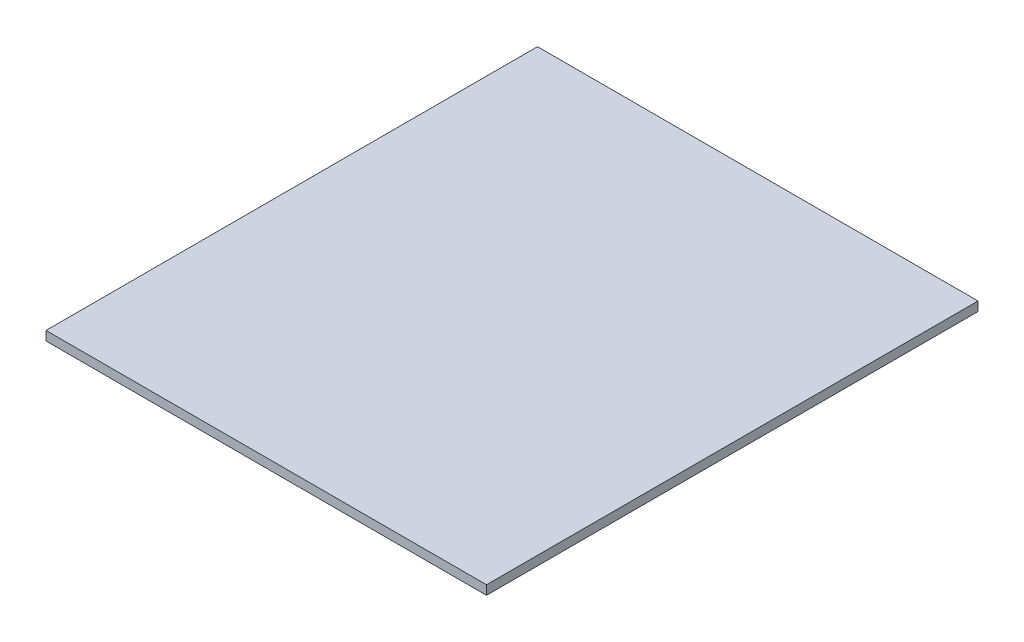
ISO-10303-21;
HEADER;
FILE_DESCRIPTION(('STEP AP214'),'2;1');
FILE_NAME('part.step','',(''),(''),'','','');
FILE_SCHEMA(('AUTOMOTIVE_DESIGN { 1 0 10303 214 1 1 1 1 }'));
ENDSEC;
DATA;
#1=APPLICATION_CONTEXT('core data for automotive mechanical design processes');
#2=APPLICATION_PROTOCOL_DEFINITION('international standard','automotive_design',2000,#1);
#3=PRODUCT_CONTEXT('',#1,'mechanical');
#4=PRODUCT('Part','Part','',(#3));
#5=PRODUCT_RELATED_PRODUCT_CATEGORY('part','',(#4));
#6=PRODUCT_DEFINITION_FORMATION('','',#4);
#7=PRODUCT_DEFINITION_CONTEXT('part definition',#1,'design');
#8=PRODUCT_DEFINITION('design','',#6,#7);
#9=PRODUCT_DEFINITION_SHAPE('','',#8);
#10=(LENGTH_UNIT() NAMED_UNIT(*) SI_UNIT(.MILLI.,.METRE.));
#11=(NAMED_UNIT(*) PLANE_ANGLE_UNIT() SI_UNIT($,.RADIAN.));
#12=(NAMED_UNIT(*) SI_UNIT($,.STERADIAN.) SOLID_ANGLE_UNIT());
#13=UNCERTAINTY_MEASURE_WITH_UNIT(LENGTH_MEASURE(1.E-05),#10,'distance_accuracy_value','');
#14=(GEOMETRIC_REPRESENTATION_CONTEXT(3) GLOBAL_UNCERTAINTY_ASSIGNED_CONTEXT((#13)) GLOBAL_UNIT_ASSIGNED_CONTEXT((#10,
#11,#12)) REPRESENTATION_CONTEXT('',''));
#15=CARTESIAN_POINT('',(0.,0.,0.));
#16=DIRECTION('',(0.,0.,1.));
#17=DIRECTION('',(1.,0.,0.));
#18=AXIS2_PLACEMENT_3D('',#15,#16,#17);
#19=CARTESIAN_POINT('',(438.94375,18.25625,489.74375));
#20=DIRECTION('',(-1.,0.,0.));
#21=DIRECTION('',(0.,0.,1.));
#22=AXIS2_PLACEMENT_3D('',#19,#20,#21);
#23=PLANE('',#22);
#24=DIRECTION('',(0.,0.,-1.));
#25=VECTOR('',#24,1.);
#26=CARTESIAN_POINT('',(438.94375,0.,489.74375));
#27=LINE('',#26,#25);
#28=CARTESIAN_POINT('',(438.94375,0.,489.74375));
#29=VERTEX_POINT('',#28);
#30=CARTESIAN_POINT('',(438.94375,0.,-489.74375));
#31=VERTEX_POINT('',#30);
#32=EDGE_CURVE('E97',#29,#31,#27,.T.);
#33=ORIENTED_EDGE('',*,*,#32,.T.);
#34=DIRECTION('',(0.,-1.,0.));
#35=VECTOR('',#34,1.);
#36=CARTESIAN_POINT('',(438.94375,18.25625,-489.74375));
#37=LINE('',#36,#35);
#38=CARTESIAN_POINT('',(438.94375,18.25625,-489.74375));
#39=VERTEX_POINT('',#38);
#40=EDGE_CURVE('E11',#39,#31,#37,.T.);
#41=ORIENTED_EDGE('',*,*,#40,.F.);
#42=DIRECTION('',(0.,0.,-1.));
#43=VECTOR('',#42,1.);
#44=CARTESIAN_POINT('',(438.94375,18.25625,489.74375));
#45=LINE('',#44,#43);
#46=CARTESIAN_POINT('',(438.94375,18.25625,489.74375));
#47=VERTEX_POINT('',#46);
#48=EDGE_CURVE('E85',#47,#39,#45,.T.);
#49=ORIENTED_EDGE('',*,*,#48,.F.);
#50=DIRECTION('',(0.,-1.,0.));
#51=VECTOR('',#50,1.);
#52=CARTESIAN_POINT('',(438.94375,18.25625,489.74375));
#53=LINE('',#52,#51);
#54=EDGE_CURVE('E93',#47,#29,#53,.T.);
#55=ORIENTED_EDGE('',*,*,#54,.T.);
#56=EDGE_LOOP('',(#33,#41,#49,#55));
#57=FACE_BOUND('',#56,.T.);
#58=ADVANCED_FACE('F34',(#57),#23,.F.);
#59=CARTESIAN_POINT('',(-438.94375,18.25625,-489.74375));
#60=DIRECTION('',(0.,0.,1.));
#61=DIRECTION('',(1.,0.,0.));
#62=AXIS2_PLACEMENT_3D('',#59,#60,#61);
#63=PLANE('',#62);
#64=DIRECTION('',(-1.,0.,0.));
#65=VECTOR('',#64,1.);
#66=CARTESIAN_POINT('',(-438.94375,0.,-489.74375));
#67=LINE('',#66,#65);
#68=CARTESIAN_POINT('',(-438.94375,0.,-489.74375));
#69=VERTEX_POINT('',#68);
#70=EDGE_CURVE('E89',#31,#69,#67,.T.);
#71=ORIENTED_EDGE('',*,*,#70,.T.);
#72=DIRECTION('',(0.,-1.,0.));
#73=VECTOR('',#72,1.);
#74=CARTESIAN_POINT('',(-438.94375,18.25625,-489.74375));
#75=LINE('',#74,#73);
#76=CARTESIAN_POINT('',(-438.94375,18.25625,-489.74375));
#77=VERTEX_POINT('',#76);
#78=EDGE_CURVE('E42',#77,#69,#75,.T.);
#79=ORIENTED_EDGE('',*,*,#78,.F.);
#80=DIRECTION('',(-1.,0.,0.));
#81=VECTOR('',#80,1.);
#82=CARTESIAN_POINT('',(-438.94375,18.25625,-489.74375));
#83=LINE('',#82,#81);
#84=EDGE_CURVE('E80',#39,#77,#83,.T.);
#85=ORIENTED_EDGE('',*,*,#84,.F.);
#86=ORIENTED_EDGE('',*,*,#40,.T.);
#87=EDGE_LOOP('',(#71,#79,#85,#86));
#88=FACE_BOUND('',#87,.T.);
#89=ADVANCED_FACE('F88',(#88),#63,.F.);
#90=CARTESIAN_POINT('',(-438.94375,18.25625,489.74375));
#91=DIRECTION('',(1.,0.,0.));
#92=DIRECTION('',(0.,0.,-1.));
#93=AXIS2_PLACEMENT_3D('',#90,#91,#92);
#94=PLANE('',#93);
#95=DIRECTION('',(0.,0.,1.));
#96=VECTOR('',#95,1.);
#97=CARTESIAN_POINT('',(-438.94375,0.,489.74375));
#98=LINE('',#97,#96);
#99=CARTESIAN_POINT('',(-438.94375,0.,489.74375));
#100=VERTEX_POINT('',#99);
#101=EDGE_CURVE('E67',#69,#100,#98,.T.);
#102=ORIENTED_EDGE('',*,*,#101,.T.);
#103=DIRECTION('',(0.,-1.,0.));
#104=VECTOR('',#103,1.);
#105=CARTESIAN_POINT('',(-438.94375,18.25625,489.74375));
#106=LINE('',#105,#104);
#107=CARTESIAN_POINT('',(-438.94375,18.25625,489.74375));
#108=VERTEX_POINT('',#107);
#109=EDGE_CURVE('E90',#108,#100,#106,.T.);
#110=ORIENTED_EDGE('',*,*,#109,.F.);
#111=DIRECTION('',(0.,0.,1.));
#112=VECTOR('',#111,1.);
#113=CARTESIAN_POINT('',(-438.94375,18.25625,489.74375));
#114=LINE('',#113,#112);
#115=EDGE_CURVE('E83',#77,#108,#114,.T.);
#116=ORIENTED_EDGE('',*,*,#115,.F.);
#117=ORIENTED_EDGE('',*,*,#78,.T.);
#118=EDGE_LOOP('',(#102,#110,#116,#117));
#119=FACE_BOUND('',#118,.T.);
#120=ADVANCED_FACE('F91',(#119),#94,.F.);
#121=CARTESIAN_POINT('',(-438.94375,18.25625,489.74375));
#122=DIRECTION('',(0.,0.,-1.));
#123=DIRECTION('',(-1.,0.,0.));
#124=AXIS2_PLACEMENT_3D('',#121,#122,#123);
#125=PLANE('',#124);
#126=DIRECTION('',(1.,0.,0.));
#127=VECTOR('',#126,1.);
#128=CARTESIAN_POINT('',(-438.94375,0.,489.74375));
#129=LINE('',#128,#127);
#130=EDGE_CURVE('E73',#100,#29,#129,.T.);
#131=ORIENTED_EDGE('',*,*,#130,.T.);
#132=ORIENTED_EDGE('',*,*,#54,.F.);
#133=DIRECTION('',(1.,0.,0.));
#134=VECTOR('',#133,1.);
#135=CARTESIAN_POINT('',(-438.94375,18.25625,489.74375));
#136=LINE('',#135,#134);
#137=EDGE_CURVE('E50',#108,#47,#136,.T.);
#138=ORIENTED_EDGE('',*,*,#137,.F.);
#139=ORIENTED_EDGE('',*,*,#109,.T.);
#140=EDGE_LOOP('',(#131,#132,#138,#139));
#141=FACE_BOUND('',#140,.T.);
#142=ADVANCED_FACE('F104',(#141),#125,.F.);
#143=CARTESIAN_POINT('',(0.,18.25625,0.));
#144=DIRECTION('',(0.,-1.,0.));
#145=DIRECTION('',(0.,0.,-1.));
#146=AXIS2_PLACEMENT_3D('',#143,#144,#145);
#147=PLANE('',#146);
#148=ORIENTED_EDGE('',*,*,#48,.T.);
#149=ORIENTED_EDGE('',*,*,#84,.T.);
#150=ORIENTED_EDGE('',*,*,#115,.T.);
#151=ORIENTED_EDGE('',*,*,#137,.T.);
#152=EDGE_LOOP('',(#148,#149,#150,#151));
#153=FACE_BOUND('',#152,.T.);
#154=ADVANCED_FACE('F81',(#153),#147,.F.);
#155=CARTESIAN_POINT('',(0.,0.,0.));
#156=DIRECTION('',(0.,-1.,0.));
#157=DIRECTION('',(0.,0.,-1.));
#158=AXIS2_PLACEMENT_3D('',#155,#156,#157);
#159=PLANE('',#158);
#160=ORIENTED_EDGE('',*,*,#32,.F.);
#161=ORIENTED_EDGE('',*,*,#130,.F.);
#162=ORIENTED_EDGE('',*,*,#101,.F.);
#163=ORIENTED_EDGE('',*,*,#70,.F.);
#164=EDGE_LOOP('',(#160,#161,#162,#163));
#165=FACE_BOUND('',#164,.T.);
#166=ADVANCED_FACE('F107',(#165),#159,.T.);
#167=CLOSED_SHELL('',(#58,#89,#120,#142,#154,#166));
#168=MANIFOLD_SOLID_BREP('B2',#167);
#169=ADVANCED_BREP_SHAPE_REPRESENTATION('',(#18,#168),#14);
#170=SHAPE_DEFINITION_REPRESENTATION(#9,#169);
ENDSEC;
END-ISO-10303-21;
